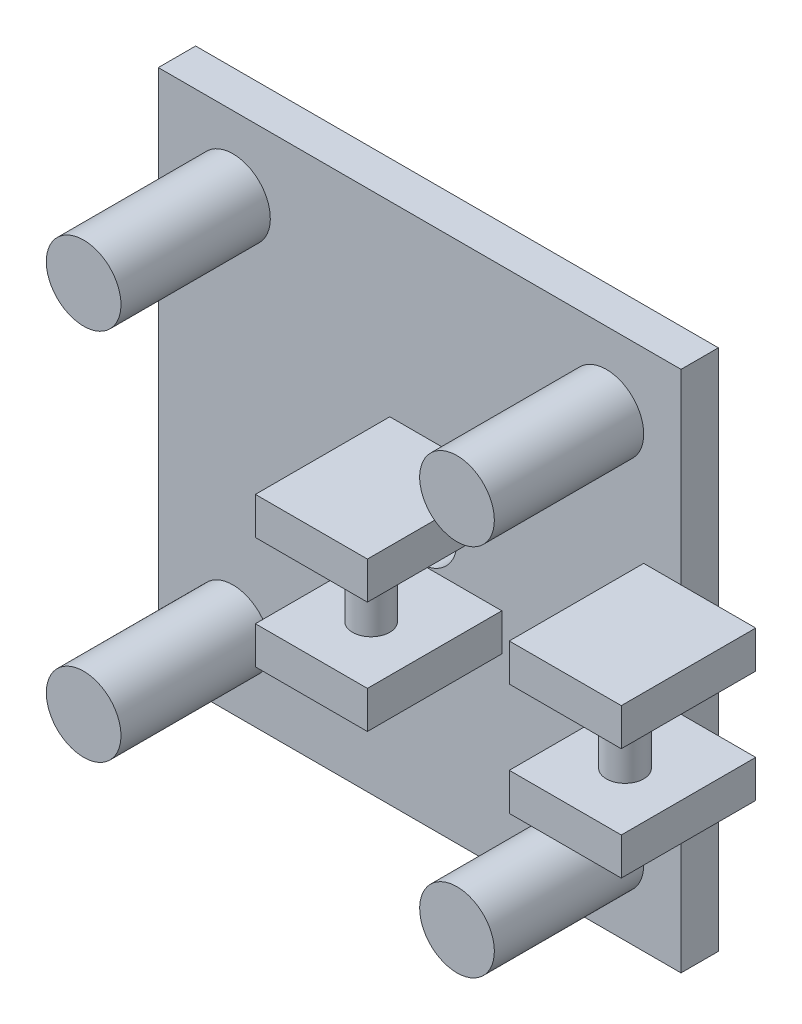
ISO-10303-21;
HEADER;
FILE_DESCRIPTION(('STEP AP214'),'2;1');
FILE_NAME('part.step','',(''),(''),'','','');
FILE_SCHEMA(('AUTOMOTIVE_DESIGN { 1 0 10303 214 1 1 1 1 }'));
ENDSEC;
DATA;
#1=APPLICATION_CONTEXT('core data for automotive mechanical design processes');
#2=APPLICATION_PROTOCOL_DEFINITION('international standard','automotive_design',2000,#1);
#3=PRODUCT_CONTEXT('',#1,'mechanical');
#4=PRODUCT('Part','Part','',(#3));
#5=PRODUCT_RELATED_PRODUCT_CATEGORY('part','',(#4));
#6=PRODUCT_DEFINITION_FORMATION('','',#4);
#7=PRODUCT_DEFINITION_CONTEXT('part definition',#1,'design');
#8=PRODUCT_DEFINITION('design','',#6,#7);
#9=PRODUCT_DEFINITION_SHAPE('','',#8);
#10=(LENGTH_UNIT() NAMED_UNIT(*) SI_UNIT(.MILLI.,.METRE.));
#11=(NAMED_UNIT(*) PLANE_ANGLE_UNIT() SI_UNIT($,.RADIAN.));
#12=(NAMED_UNIT(*) SI_UNIT($,.STERADIAN.) SOLID_ANGLE_UNIT());
#13=UNCERTAINTY_MEASURE_WITH_UNIT(LENGTH_MEASURE(1.E-05),#10,'distance_accuracy_value','');
#14=(GEOMETRIC_REPRESENTATION_CONTEXT(3) GLOBAL_UNCERTAINTY_ASSIGNED_CONTEXT((#13)) GLOBAL_UNIT_ASSIGNED_CONTEXT((#10,
#11,#12)) REPRESENTATION_CONTEXT('',''));
#15=CARTESIAN_POINT('',(0.,0.,0.));
#16=DIRECTION('',(0.,0.,1.));
#17=DIRECTION('',(1.,0.,0.));
#18=AXIS2_PLACEMENT_3D('',#15,#16,#17);
#19=CARTESIAN_POINT('',(0.,0.,5.));
#20=DIRECTION('',(0.,0.,1.));
#21=DIRECTION('',(1.,0.,0.));
#22=AXIS2_PLACEMENT_3D('',#19,#20,#21);
#23=PLANE('',#22);
#24=CARTESIAN_POINT('',(-24.9999999999997,25.0000000000003,5.));
#25=DIRECTION('',(0.,0.,1.));
#26=DIRECTION('',(0.,1.,0.));
#27=AXIS2_PLACEMENT_3D('',#24,#25,#26);
#28=CIRCLE('',#27,5.);
#29=CARTESIAN_POINT('',(-24.9999999999997,30.0000000000003,5.));
#30=VERTEX_POINT('',#29);
#31=EDGE_CURVE('E316',#30,#30,#28,.T.);
#32=ORIENTED_EDGE('',*,*,#31,.F.);
#33=EDGE_LOOP('',(#32));
#34=FACE_BOUND('',#33,.T.);
#35=CARTESIAN_POINT('',(-25.,-25.,5.));
#36=DIRECTION('',(0.,0.,1.));
#37=DIRECTION('',(-1.,0.,0.));
#38=AXIS2_PLACEMENT_3D('',#35,#36,#37);
#39=CIRCLE('',#38,5.);
#40=CARTESIAN_POINT('',(-30.,-25.,5.));
#41=VERTEX_POINT('',#40);
#42=EDGE_CURVE('E320',#41,#41,#39,.T.);
#43=ORIENTED_EDGE('',*,*,#42,.F.);
#44=EDGE_LOOP('',(#43));
#45=FACE_BOUND('',#44,.T.);
#46=CARTESIAN_POINT('',(24.9999999999999,-25.0000000000001,5.));
#47=DIRECTION('',(0.,0.,1.));
#48=DIRECTION('',(0.,-1.,0.));
#49=AXIS2_PLACEMENT_3D('',#46,#47,#48);
#50=CIRCLE('',#49,5.);
#51=CARTESIAN_POINT('',(24.9999999999999,-30.0000000000001,5.));
#52=VERTEX_POINT('',#51);
#53=EDGE_CURVE('E326',#52,#52,#50,.T.);
#54=ORIENTED_EDGE('',*,*,#53,.F.);
#55=EDGE_LOOP('',(#54));
#56=FACE_BOUND('',#55,.T.);
#57=CARTESIAN_POINT('',(25.,25.,5.));
#58=DIRECTION('',(0.,0.,1.));
#59=DIRECTION('',(1.,0.,0.));
#60=AXIS2_PLACEMENT_3D('',#57,#58,#59);
#61=CIRCLE('',#60,5.);
#62=CARTESIAN_POINT('',(30.,25.,5.));
#63=VERTEX_POINT('',#62);
#64=EDGE_CURVE('E332',#63,#63,#61,.T.);
#65=ORIENTED_EDGE('',*,*,#64,.F.);
#66=EDGE_LOOP('',(#65));
#67=FACE_BOUND('',#66,.T.);
#68=DIRECTION('',(-1.,0.,0.));
#69=VECTOR('',#68,1.);
#70=CARTESIAN_POINT('',(-4.,10.,5.));
#71=LINE('',#70,#69);
#72=CARTESIAN_POINT('',(11.,10.,5.));
#73=VERTEX_POINT('',#72);
#74=CARTESIAN_POINT('',(-4.,10.,5.));
#75=VERTEX_POINT('',#74);
#76=EDGE_CURVE('E269',#73,#75,#71,.T.);
#77=ORIENTED_EDGE('',*,*,#76,.F.);
#78=DIRECTION('',(0.,1.,0.));
#79=VECTOR('',#78,1.);
#80=CARTESIAN_POINT('',(11.,5.,5.));
#81=LINE('',#80,#79);
#82=CARTESIAN_POINT('',(11.,5.,5.));
#83=VERTEX_POINT('',#82);
#84=EDGE_CURVE('E255',#83,#73,#81,.T.);
#85=ORIENTED_EDGE('',*,*,#84,.F.);
#86=DIRECTION('',(1.,0.,0.));
#87=VECTOR('',#86,1.);
#88=CARTESIAN_POINT('',(-4.,5.,5.));
#89=LINE('',#88,#87);
#90=CARTESIAN_POINT('',(0.,5.,5.));
#91=VERTEX_POINT('',#90);
#92=EDGE_CURVE('E274',#91,#83,#89,.T.);
#93=ORIENTED_EDGE('',*,*,#92,.F.);
#94=CARTESIAN_POINT('',(0.,0.,5.));
#95=DIRECTION('',(0.,0.,1.));
#96=DIRECTION('',(1.,0.,0.));
#97=AXIS2_PLACEMENT_3D('',#94,#95,#96);
#98=CIRCLE('',#97,5.);
#99=CARTESIAN_POINT('',(0.,-5.,5.));
#100=VERTEX_POINT('',#99);
#101=EDGE_CURVE('E341',#100,#91,#98,.T.);
#102=ORIENTED_EDGE('',*,*,#101,.F.);
#103=DIRECTION('',(-1.,0.,0.));
#104=VECTOR('',#103,1.);
#105=CARTESIAN_POINT('',(-4.,-5.,5.));
#106=LINE('',#105,#104);
#107=CARTESIAN_POINT('',(11.,-5.,5.));
#108=VERTEX_POINT('',#107);
#109=EDGE_CURVE('E300',#108,#100,#106,.T.);
#110=ORIENTED_EDGE('',*,*,#109,.F.);
#111=DIRECTION('',(0.,1.,0.));
#112=VECTOR('',#111,1.);
#113=CARTESIAN_POINT('',(11.,-10.,5.));
#114=LINE('',#113,#112);
#115=CARTESIAN_POINT('',(11.,-10.,5.));
#116=VERTEX_POINT('',#115);
#117=EDGE_CURVE('E285',#116,#108,#114,.T.);
#118=ORIENTED_EDGE('',*,*,#117,.F.);
#119=DIRECTION('',(1.,0.,0.));
#120=VECTOR('',#119,1.);
#121=CARTESIAN_POINT('',(-4.,-10.,5.));
#122=LINE('',#121,#120);
#123=CARTESIAN_POINT('',(-4.,-10.,5.));
#124=VERTEX_POINT('',#123);
#125=EDGE_CURVE('E290',#124,#116,#122,.T.);
#126=ORIENTED_EDGE('',*,*,#125,.F.);
#127=DIRECTION('',(0.,-1.,0.));
#128=VECTOR('',#127,1.);
#129=CARTESIAN_POINT('',(-4.,-10.,5.));
#130=LINE('',#129,#128);
#131=CARTESIAN_POINT('',(-4.,-5.,5.));
#132=VERTEX_POINT('',#131);
#133=EDGE_CURVE('E303',#132,#124,#130,.T.);
#134=ORIENTED_EDGE('',*,*,#133,.F.);
#135=EDGE_CURVE('E299',#100,#132,#106,.T.);
#136=ORIENTED_EDGE('',*,*,#135,.F.);
#137=EDGE_CURVE('E345',#91,#100,#98,.T.);
#138=ORIENTED_EDGE('',*,*,#137,.F.);
#139=CARTESIAN_POINT('',(-4.,5.,5.));
#140=VERTEX_POINT('',#139);
#141=EDGE_CURVE('E260',#140,#91,#89,.T.);
#142=ORIENTED_EDGE('',*,*,#141,.F.);
#143=DIRECTION('',(0.,-1.,0.));
#144=VECTOR('',#143,1.);
#145=CARTESIAN_POINT('',(-4.,5.,5.));
#146=LINE('',#145,#144);
#147=EDGE_CURVE('E271',#75,#140,#146,.T.);
#148=ORIENTED_EDGE('',*,*,#147,.F.);
#149=EDGE_LOOP('',(#77,#85,#93,#102,#110,#118,#126,#134,#136,#138,#142,#148));
#150=FACE_BOUND('',#149,.T.);
#151=DIRECTION('',(0.,-1.,0.));
#152=VECTOR('',#151,1.);
#153=CARTESIAN_POINT('',(30.,5.,5.));
#154=LINE('',#153,#152);
#155=CARTESIAN_POINT('',(30.,10.,5.));
#156=VERTEX_POINT('',#155);
#157=CARTESIAN_POINT('',(30.,5.,5.));
#158=VERTEX_POINT('',#157);
#159=EDGE_CURVE('E50',#156,#158,#154,.T.);
#160=ORIENTED_EDGE('',*,*,#159,.F.);
#161=DIRECTION('',(-1.,0.,0.));
#162=VECTOR('',#161,1.);
#163=CARTESIAN_POINT('',(30.,10.,5.));
#164=LINE('',#163,#162);
#165=CARTESIAN_POINT('',(35.,10.,5.));
#166=VERTEX_POINT('',#165);
#167=EDGE_CURVE('E392',#166,#156,#164,.T.);
#168=ORIENTED_EDGE('',*,*,#167,.F.);
#169=DIRECTION('',(0.,1.,0.));
#170=VECTOR('',#169,1.);
#171=CARTESIAN_POINT('',(35.,35.,5.));
#172=LINE('',#171,#170);
#173=CARTESIAN_POINT('',(35.,35.,5.));
#174=VERTEX_POINT('',#173);
#175=EDGE_CURVE('E353',#166,#174,#172,.T.);
#176=ORIENTED_EDGE('',*,*,#175,.T.);
#177=DIRECTION('',(-1.,0.,0.));
#178=VECTOR('',#177,1.);
#179=CARTESIAN_POINT('',(-35.,35.,5.));
#180=LINE('',#179,#178);
#181=CARTESIAN_POINT('',(-35.,35.,5.));
#182=VERTEX_POINT('',#181);
#183=EDGE_CURVE('E351',#174,#182,#180,.T.);
#184=ORIENTED_EDGE('',*,*,#183,.T.);
#185=DIRECTION('',(0.,-1.,0.));
#186=VECTOR('',#185,1.);
#187=CARTESIAN_POINT('',(-35.,35.,5.));
#188=LINE('',#187,#186);
#189=CARTESIAN_POINT('',(-35.,-35.,5.));
#190=VERTEX_POINT('',#189);
#191=EDGE_CURVE('E355',#182,#190,#188,.T.);
#192=ORIENTED_EDGE('',*,*,#191,.T.);
#193=DIRECTION('',(1.,0.,0.));
#194=VECTOR('',#193,1.);
#195=CARTESIAN_POINT('',(-35.,-35.,5.));
#196=LINE('',#195,#194);
#197=CARTESIAN_POINT('',(35.,-35.,5.));
#198=VERTEX_POINT('',#197);
#199=EDGE_CURVE('E357',#190,#198,#196,.T.);
#200=ORIENTED_EDGE('',*,*,#199,.T.);
#201=CARTESIAN_POINT('',(35.,-10.,5.));
#202=VERTEX_POINT('',#201);
#203=EDGE_CURVE('E348',#198,#202,#172,.T.);
#204=ORIENTED_EDGE('',*,*,#203,.T.);
#205=DIRECTION('',(1.,0.,0.));
#206=VECTOR('',#205,1.);
#207=CARTESIAN_POINT('',(30.,-10.,5.));
#208=LINE('',#207,#206);
#209=CARTESIAN_POINT('',(30.,-10.,5.));
#210=VERTEX_POINT('',#209);
#211=EDGE_CURVE('E228',#210,#202,#208,.T.);
#212=ORIENTED_EDGE('',*,*,#211,.F.);
#213=DIRECTION('',(0.,-1.,0.));
#214=VECTOR('',#213,1.);
#215=CARTESIAN_POINT('',(30.,-10.,5.));
#216=LINE('',#215,#214);
#217=CARTESIAN_POINT('',(30.,-5.,5.));
#218=VERTEX_POINT('',#217);
#219=EDGE_CURVE('E238',#218,#210,#216,.T.);
#220=ORIENTED_EDGE('',*,*,#219,.F.);
#221=DIRECTION('',(-1.,0.,0.));
#222=VECTOR('',#221,1.);
#223=CARTESIAN_POINT('',(30.,-5.,5.));
#224=LINE('',#223,#222);
#225=CARTESIAN_POINT('',(35.,-5.,5.));
#226=VERTEX_POINT('',#225);
#227=EDGE_CURVE('E218',#226,#218,#224,.T.);
#228=ORIENTED_EDGE('',*,*,#227,.F.);
#229=CARTESIAN_POINT('',(35.,5.,5.));
#230=VERTEX_POINT('',#229);
#231=EDGE_CURVE('E857',#226,#230,#172,.T.);
#232=ORIENTED_EDGE('',*,*,#231,.T.);
#233=DIRECTION('',(1.,0.,0.));
#234=VECTOR('',#233,1.);
#235=CARTESIAN_POINT('',(30.,5.,5.));
#236=LINE('',#235,#234);
#237=EDGE_CURVE('E55',#158,#230,#236,.T.);
#238=ORIENTED_EDGE('',*,*,#237,.F.);
#239=EDGE_LOOP('',(#160,#168,#176,#184,#192,#200,#204,#212,#220,#228,#232,#238));
#240=FACE_BOUND('',#239,.T.);
#241=ADVANCED_FACE('F33',(#34,#45,#56,#67,#150,#240),#23,.T.);
#242=CARTESIAN_POINT('',(0.,0.,0.));
#243=DIRECTION('',(0.,0.,1.));
#244=DIRECTION('',(1.,0.,0.));
#245=AXIS2_PLACEMENT_3D('',#242,#243,#244);
#246=PLANE('',#245);
#247=DIRECTION('',(0.,1.,0.));
#248=VECTOR('',#247,1.);
#249=CARTESIAN_POINT('',(35.,35.,0.));
#250=LINE('',#249,#248);
#251=CARTESIAN_POINT('',(35.,-35.,0.));
#252=VERTEX_POINT('',#251);
#253=CARTESIAN_POINT('',(35.,35.,0.));
#254=VERTEX_POINT('',#253);
#255=EDGE_CURVE('E344',#252,#254,#250,.T.);
#256=ORIENTED_EDGE('',*,*,#255,.F.);
#257=DIRECTION('',(1.,0.,0.));
#258=VECTOR('',#257,1.);
#259=CARTESIAN_POINT('',(-35.,-35.,0.));
#260=LINE('',#259,#258);
#261=CARTESIAN_POINT('',(-35.,-35.,0.));
#262=VERTEX_POINT('',#261);
#263=EDGE_CURVE('E366',#262,#252,#260,.T.);
#264=ORIENTED_EDGE('',*,*,#263,.F.);
#265=DIRECTION('',(0.,-1.,0.));
#266=VECTOR('',#265,1.);
#267=CARTESIAN_POINT('',(-35.,35.,0.));
#268=LINE('',#267,#266);
#269=CARTESIAN_POINT('',(-35.,35.,0.));
#270=VERTEX_POINT('',#269);
#271=EDGE_CURVE('E364',#270,#262,#268,.T.);
#272=ORIENTED_EDGE('',*,*,#271,.F.);
#273=DIRECTION('',(-1.,0.,0.));
#274=VECTOR('',#273,1.);
#275=CARTESIAN_POINT('',(-35.,35.,0.));
#276=LINE('',#275,#274);
#277=EDGE_CURVE('E362',#254,#270,#276,.T.);
#278=ORIENTED_EDGE('',*,*,#277,.F.);
#279=EDGE_LOOP('',(#256,#264,#272,#278));
#280=FACE_BOUND('',#279,.T.);
#281=CARTESIAN_POINT('',(0.,0.,0.));
#282=DIRECTION('',(0.,0.,1.));
#283=DIRECTION('',(1.,0.,0.));
#284=AXIS2_PLACEMENT_3D('',#281,#282,#283);
#285=CIRCLE('',#284,5.);
#286=CARTESIAN_POINT('',(5.,0.,0.));
#287=VERTEX_POINT('',#286);
#288=EDGE_CURVE('E338',#287,#287,#285,.T.);
#289=ORIENTED_EDGE('',*,*,#288,.T.);
#290=EDGE_LOOP('',(#289));
#291=FACE_BOUND('',#290,.T.);
#292=ADVANCED_FACE('F414',(#280,#291),#246,.F.);
#293=CARTESIAN_POINT('',(35.,35.,5.));
#294=DIRECTION('',(-1.,0.,0.));
#295=DIRECTION('',(0.,-1.,0.));
#296=AXIS2_PLACEMENT_3D('',#293,#294,#295);
#297=PLANE('',#296);
#298=ORIENTED_EDGE('',*,*,#255,.T.);
#299=DIRECTION('',(0.,0.,-1.));
#300=VECTOR('',#299,1.);
#301=CARTESIAN_POINT('',(35.,35.,5.));
#302=LINE('',#301,#300);
#303=EDGE_CURVE('E11',#174,#254,#302,.T.);
#304=ORIENTED_EDGE('',*,*,#303,.F.);
#305=ORIENTED_EDGE('',*,*,#175,.F.);
#306=EDGE_CURVE('E856',#230,#166,#172,.T.);
#307=ORIENTED_EDGE('',*,*,#306,.F.);
#308=ORIENTED_EDGE('',*,*,#231,.F.);
#309=EDGE_CURVE('E352',#202,#226,#172,.T.);
#310=ORIENTED_EDGE('',*,*,#309,.F.);
#311=ORIENTED_EDGE('',*,*,#203,.F.);
#312=DIRECTION('',(0.,0.,-1.));
#313=VECTOR('',#312,1.);
#314=CARTESIAN_POINT('',(35.,-35.,5.));
#315=LINE('',#314,#313);
#316=EDGE_CURVE('E359',#198,#252,#315,.T.);
#317=ORIENTED_EDGE('',*,*,#316,.T.);
#318=EDGE_LOOP('',(#298,#304,#305,#307,#308,#310,#311,#317));
#319=FACE_BOUND('',#318,.T.);
#320=ADVANCED_FACE('F35',(#319),#297,.F.);
#321=CARTESIAN_POINT('',(-35.,35.,5.));
#322=DIRECTION('',(0.,-1.,0.));
#323=DIRECTION('',(0.,0.,-1.));
#324=AXIS2_PLACEMENT_3D('',#321,#322,#323);
#325=PLANE('',#324);
#326=ORIENTED_EDGE('',*,*,#277,.T.);
#327=DIRECTION('',(0.,0.,-1.));
#328=VECTOR('',#327,1.);
#329=CARTESIAN_POINT('',(-35.,35.,5.));
#330=LINE('',#329,#328);
#331=EDGE_CURVE('E42',#182,#270,#330,.T.);
#332=ORIENTED_EDGE('',*,*,#331,.F.);
#333=ORIENTED_EDGE('',*,*,#183,.F.);
#334=ORIENTED_EDGE('',*,*,#303,.T.);
#335=EDGE_LOOP('',(#326,#332,#333,#334));
#336=FACE_BOUND('',#335,.T.);
#337=ADVANCED_FACE('F436',(#336),#325,.F.);
#338=CARTESIAN_POINT('',(-35.,35.,5.));
#339=DIRECTION('',(1.,0.,0.));
#340=DIRECTION('',(0.,1.,0.));
#341=AXIS2_PLACEMENT_3D('',#338,#339,#340);
#342=PLANE('',#341);
#343=ORIENTED_EDGE('',*,*,#271,.T.);
#344=DIRECTION('',(0.,0.,-1.));
#345=VECTOR('',#344,1.);
#346=CARTESIAN_POINT('',(-35.,-35.,5.));
#347=LINE('',#346,#345);
#348=EDGE_CURVE('E370',#190,#262,#347,.T.);
#349=ORIENTED_EDGE('',*,*,#348,.F.);
#350=ORIENTED_EDGE('',*,*,#191,.F.);
#351=ORIENTED_EDGE('',*,*,#331,.T.);
#352=EDGE_LOOP('',(#343,#349,#350,#351));
#353=FACE_BOUND('',#352,.T.);
#354=ADVANCED_FACE('F433',(#353),#342,.F.);
#355=CARTESIAN_POINT('',(-35.,-35.,5.));
#356=DIRECTION('',(0.,1.,0.));
#357=DIRECTION('',(0.,0.,1.));
#358=AXIS2_PLACEMENT_3D('',#355,#356,#357);
#359=PLANE('',#358);
#360=ORIENTED_EDGE('',*,*,#263,.T.);
#361=ORIENTED_EDGE('',*,*,#316,.F.);
#362=ORIENTED_EDGE('',*,*,#199,.F.);
#363=ORIENTED_EDGE('',*,*,#348,.T.);
#364=EDGE_LOOP('',(#360,#361,#362,#363));
#365=FACE_BOUND('',#364,.T.);
#366=ADVANCED_FACE('F430',(#365),#359,.F.);
#367=CARTESIAN_POINT('',(0.,0.,5.));
#368=DIRECTION('',(0.,0.,-1.));
#369=DIRECTION('',(-1.,0.,0.));
#370=AXIS2_PLACEMENT_3D('',#367,#368,#369);
#371=CYLINDRICAL_SURFACE('',#370,5.);
#372=ORIENTED_EDGE('',*,*,#101,.T.);
#373=ORIENTED_EDGE('',*,*,#137,.T.);
#374=EDGE_LOOP('',(#372,#373));
#375=FACE_BOUND('',#374,.T.);
#376=ORIENTED_EDGE('',*,*,#288,.F.);
#377=EDGE_LOOP('',(#376));
#378=FACE_BOUND('',#377,.T.);
#379=ADVANCED_FACE('F427',(#375,#378),#371,.F.);
#380=CARTESIAN_POINT('',(25.,25.,25.));
#381=DIRECTION('',(0.,0.,-1.));
#382=DIRECTION('',(-1.,0.,0.));
#383=AXIS2_PLACEMENT_3D('',#380,#381,#382);
#384=CYLINDRICAL_SURFACE('',#383,5.);
#385=CARTESIAN_POINT('',(25.,25.,25.));
#386=DIRECTION('',(0.,0.,1.));
#387=DIRECTION('',(1.,0.,0.));
#388=AXIS2_PLACEMENT_3D('',#385,#386,#387);
#389=CIRCLE('',#388,5.);
#390=CARTESIAN_POINT('',(30.,25.,25.));
#391=VERTEX_POINT('',#390);
#392=EDGE_CURVE('E335',#391,#391,#389,.T.);
#393=ORIENTED_EDGE('',*,*,#392,.F.);
#394=EDGE_LOOP('',(#393));
#395=FACE_BOUND('',#394,.T.);
#396=ORIENTED_EDGE('',*,*,#64,.T.);
#397=EDGE_LOOP('',(#396));
#398=FACE_BOUND('',#397,.T.);
#399=ADVANCED_FACE('F565',(#395,#398),#384,.T.);
#400=CARTESIAN_POINT('',(25.,25.,25.));
#401=DIRECTION('',(0.,0.,1.));
#402=DIRECTION('',(1.,0.,0.));
#403=AXIS2_PLACEMENT_3D('',#400,#401,#402);
#404=PLANE('',#403);
#405=ORIENTED_EDGE('',*,*,#392,.T.);
#406=EDGE_LOOP('',(#405));
#407=FACE_BOUND('',#406,.T.);
#408=ADVANCED_FACE('F562',(#407),#404,.T.);
#409=CARTESIAN_POINT('',(24.9999999999999,-25.0000000000001,25.));
#410=DIRECTION('',(0.,0.,-1.));
#411=DIRECTION('',(-1.,0.,0.));
#412=AXIS2_PLACEMENT_3D('',#409,#410,#411);
#413=CYLINDRICAL_SURFACE('',#412,5.);
#414=CARTESIAN_POINT('',(24.9999999999999,-25.0000000000001,25.));
#415=DIRECTION('',(0.,0.,1.));
#416=DIRECTION('',(0.,-1.,0.));
#417=AXIS2_PLACEMENT_3D('',#414,#415,#416);
#418=CIRCLE('',#417,5.);
#419=CARTESIAN_POINT('',(24.9999999999999,-30.0000000000001,25.));
#420=VERTEX_POINT('',#419);
#421=EDGE_CURVE('E329',#420,#420,#418,.T.);
#422=ORIENTED_EDGE('',*,*,#421,.F.);
#423=EDGE_LOOP('',(#422));
#424=FACE_BOUND('',#423,.T.);
#425=ORIENTED_EDGE('',*,*,#53,.T.);
#426=EDGE_LOOP('',(#425));
#427=FACE_BOUND('',#426,.T.);
#428=ADVANCED_FACE('F558',(#424,#427),#413,.T.);
#429=CARTESIAN_POINT('',(24.9999999999999,-25.0000000000001,25.));
#430=DIRECTION('',(0.,0.,1.));
#431=DIRECTION('',(0.,-1.,0.));
#432=AXIS2_PLACEMENT_3D('',#429,#430,#431);
#433=PLANE('',#432);
#434=ORIENTED_EDGE('',*,*,#421,.T.);
#435=EDGE_LOOP('',(#434));
#436=FACE_BOUND('',#435,.T.);
#437=ADVANCED_FACE('F554',(#436),#433,.T.);
#438=CARTESIAN_POINT('',(-25.,-25.,25.));
#439=DIRECTION('',(0.,0.,-1.));
#440=DIRECTION('',(-1.,0.,0.));
#441=AXIS2_PLACEMENT_3D('',#438,#439,#440);
#442=CYLINDRICAL_SURFACE('',#441,5.);
#443=CARTESIAN_POINT('',(-25.,-25.,25.));
#444=DIRECTION('',(0.,0.,1.));
#445=DIRECTION('',(-1.,0.,0.));
#446=AXIS2_PLACEMENT_3D('',#443,#444,#445);
#447=CIRCLE('',#446,5.);
#448=CARTESIAN_POINT('',(-30.,-25.,25.));
#449=VERTEX_POINT('',#448);
#450=EDGE_CURVE('E323',#449,#449,#447,.T.);
#451=ORIENTED_EDGE('',*,*,#450,.F.);
#452=EDGE_LOOP('',(#451));
#453=FACE_BOUND('',#452,.T.);
#454=ORIENTED_EDGE('',*,*,#42,.T.);
#455=EDGE_LOOP('',(#454));
#456=FACE_BOUND('',#455,.T.);
#457=ADVANCED_FACE('F550',(#453,#456),#442,.T.);
#458=CARTESIAN_POINT('',(-25.,-25.,25.));
#459=DIRECTION('',(0.,0.,1.));
#460=DIRECTION('',(-1.,0.,0.));
#461=AXIS2_PLACEMENT_3D('',#458,#459,#460);
#462=PLANE('',#461);
#463=ORIENTED_EDGE('',*,*,#450,.T.);
#464=EDGE_LOOP('',(#463));
#465=FACE_BOUND('',#464,.T.);
#466=ADVANCED_FACE('F546',(#465),#462,.T.);
#467=CARTESIAN_POINT('',(-24.9999999999997,25.0000000000003,25.));
#468=DIRECTION('',(0.,0.,-1.));
#469=DIRECTION('',(-1.,0.,0.));
#470=AXIS2_PLACEMENT_3D('',#467,#468,#469);
#471=CYLINDRICAL_SURFACE('',#470,5.);
#472=CARTESIAN_POINT('',(-24.9999999999997,25.0000000000003,25.));
#473=DIRECTION('',(0.,0.,1.));
#474=DIRECTION('',(0.,1.,0.));
#475=AXIS2_PLACEMENT_3D('',#472,#473,#474);
#476=CIRCLE('',#475,5.);
#477=CARTESIAN_POINT('',(-24.9999999999997,30.0000000000003,25.));
#478=VERTEX_POINT('',#477);
#479=EDGE_CURVE('E317',#478,#478,#476,.T.);
#480=ORIENTED_EDGE('',*,*,#479,.F.);
#481=EDGE_LOOP('',(#480));
#482=FACE_BOUND('',#481,.T.);
#483=ORIENTED_EDGE('',*,*,#31,.T.);
#484=EDGE_LOOP('',(#483));
#485=FACE_BOUND('',#484,.T.);
#486=ADVANCED_FACE('F542',(#482,#485),#471,.T.);
#487=CARTESIAN_POINT('',(-24.9999999999997,25.0000000000003,25.));
#488=DIRECTION('',(0.,0.,1.));
#489=DIRECTION('',(0.,1.,0.));
#490=AXIS2_PLACEMENT_3D('',#487,#488,#489);
#491=PLANE('',#490);
#492=ORIENTED_EDGE('',*,*,#479,.T.);
#493=EDGE_LOOP('',(#492));
#494=FACE_BOUND('',#493,.T.);
#495=ADVANCED_FACE('F538',(#494),#491,.T.);
#496=CARTESIAN_POINT('',(11.,-10.,23.));
#497=DIRECTION('',(-1.,0.,0.));
#498=DIRECTION('',(0.,0.,1.));
#499=AXIS2_PLACEMENT_3D('',#496,#497,#498);
#500=PLANE('',#499);
#501=ORIENTED_EDGE('',*,*,#117,.T.);
#502=DIRECTION('',(0.,0.,-1.));
#503=VECTOR('',#502,1.);
#504=CARTESIAN_POINT('',(11.,-5.,23.));
#505=LINE('',#504,#503);
#506=CARTESIAN_POINT('',(11.,-5.,23.));
#507=VERTEX_POINT('',#506);
#508=EDGE_CURVE('E314',#507,#108,#505,.T.);
#509=ORIENTED_EDGE('',*,*,#508,.F.);
#510=DIRECTION('',(0.,1.,0.));
#511=VECTOR('',#510,1.);
#512=CARTESIAN_POINT('',(11.,-10.,23.));
#513=LINE('',#512,#511);
#514=CARTESIAN_POINT('',(11.,-10.,23.));
#515=VERTEX_POINT('',#514);
#516=EDGE_CURVE('E286',#515,#507,#513,.T.);
#517=ORIENTED_EDGE('',*,*,#516,.F.);
#518=DIRECTION('',(0.,0.,-1.));
#519=VECTOR('',#518,1.);
#520=CARTESIAN_POINT('',(11.,-10.,23.));
#521=LINE('',#520,#519);
#522=EDGE_CURVE('E296',#515,#116,#521,.T.);
#523=ORIENTED_EDGE('',*,*,#522,.T.);
#524=EDGE_LOOP('',(#501,#509,#517,#523));
#525=FACE_BOUND('',#524,.T.);
#526=ADVANCED_FACE('F534',(#525),#500,.F.);
#527=CARTESIAN_POINT('',(-4.,-5.,23.));
#528=DIRECTION('',(0.,-1.,0.));
#529=DIRECTION('',(0.,0.,-1.));
#530=AXIS2_PLACEMENT_3D('',#527,#528,#529);
#531=PLANE('',#530);
#532=CARTESIAN_POINT('',(3.5,-5.,15.));
#533=DIRECTION('',(0.,-1.,0.));
#534=DIRECTION('',(0.,0.,-1.));
#535=AXIS2_PLACEMENT_3D('',#532,#533,#534);
#536=CIRCLE('',#535,2.5);
#537=CARTESIAN_POINT('',(3.5,-5.,12.5));
#538=VERTEX_POINT('',#537);
#539=EDGE_CURVE('E376',#538,#538,#536,.T.);
#540=ORIENTED_EDGE('',*,*,#539,.T.);
#541=EDGE_LOOP('',(#540));
#542=FACE_BOUND('',#541,.T.);
#543=ORIENTED_EDGE('',*,*,#109,.T.);
#544=ORIENTED_EDGE('',*,*,#135,.T.);
#545=DIRECTION('',(0.,0.,-1.));
#546=VECTOR('',#545,1.);
#547=CARTESIAN_POINT('',(-4.,-5.,23.));
#548=LINE('',#547,#546);
#549=CARTESIAN_POINT('',(-4.,-5.,23.));
#550=VERTEX_POINT('',#549);
#551=EDGE_CURVE('E311',#550,#132,#548,.T.);
#552=ORIENTED_EDGE('',*,*,#551,.F.);
#553=DIRECTION('',(-1.,0.,0.));
#554=VECTOR('',#553,1.);
#555=CARTESIAN_POINT('',(-4.,-5.,23.));
#556=LINE('',#555,#554);
#557=EDGE_CURVE('E289',#507,#550,#556,.T.);
#558=ORIENTED_EDGE('',*,*,#557,.F.);
#559=ORIENTED_EDGE('',*,*,#508,.T.);
#560=EDGE_LOOP('',(#543,#544,#552,#558,#559));
#561=FACE_BOUND('',#560,.T.);
#562=ADVANCED_FACE('F530',(#542,#561),#531,.F.);
#563=CARTESIAN_POINT('',(-4.,-10.,23.));
#564=DIRECTION('',(1.,0.,0.));
#565=DIRECTION('',(0.,0.,-1.));
#566=AXIS2_PLACEMENT_3D('',#563,#564,#565);
#567=PLANE('',#566);
#568=ORIENTED_EDGE('',*,*,#133,.T.);
#569=DIRECTION('',(0.,0.,-1.));
#570=VECTOR('',#569,1.);
#571=CARTESIAN_POINT('',(-4.,-10.,23.));
#572=LINE('',#571,#570);
#573=CARTESIAN_POINT('',(-4.,-10.,23.));
#574=VERTEX_POINT('',#573);
#575=EDGE_CURVE('E309',#574,#124,#572,.T.);
#576=ORIENTED_EDGE('',*,*,#575,.F.);
#577=DIRECTION('',(0.,-1.,0.));
#578=VECTOR('',#577,1.);
#579=CARTESIAN_POINT('',(-4.,-10.,23.));
#580=LINE('',#579,#578);
#581=EDGE_CURVE('E292',#550,#574,#580,.T.);
#582=ORIENTED_EDGE('',*,*,#581,.F.);
#583=ORIENTED_EDGE('',*,*,#551,.T.);
#584=EDGE_LOOP('',(#568,#576,#582,#583));
#585=FACE_BOUND('',#584,.T.);
#586=ADVANCED_FACE('F526',(#585),#567,.F.);
#587=CARTESIAN_POINT('',(-4.,-10.,23.));
#588=DIRECTION('',(0.,1.,0.));
#589=DIRECTION('',(0.,0.,1.));
#590=AXIS2_PLACEMENT_3D('',#587,#588,#589);
#591=PLANE('',#590);
#592=ORIENTED_EDGE('',*,*,#125,.T.);
#593=ORIENTED_EDGE('',*,*,#522,.F.);
#594=DIRECTION('',(1.,0.,0.));
#595=VECTOR('',#594,1.);
#596=CARTESIAN_POINT('',(-4.,-10.,23.));
#597=LINE('',#596,#595);
#598=EDGE_CURVE('E294',#574,#515,#597,.T.);
#599=ORIENTED_EDGE('',*,*,#598,.F.);
#600=ORIENTED_EDGE('',*,*,#575,.T.);
#601=EDGE_LOOP('',(#592,#593,#599,#600));
#602=FACE_BOUND('',#601,.T.);
#603=ADVANCED_FACE('F522',(#602),#591,.F.);
#604=CARTESIAN_POINT('',(0.,0.,23.));
#605=DIRECTION('',(0.,0.,-1.));
#606=DIRECTION('',(-1.,0.,0.));
#607=AXIS2_PLACEMENT_3D('',#604,#605,#606);
#608=PLANE('',#607);
#609=ORIENTED_EDGE('',*,*,#516,.T.);
#610=ORIENTED_EDGE('',*,*,#557,.T.);
#611=ORIENTED_EDGE('',*,*,#581,.T.);
#612=ORIENTED_EDGE('',*,*,#598,.T.);
#613=EDGE_LOOP('',(#609,#610,#611,#612));
#614=FACE_BOUND('',#613,.T.);
#615=ADVANCED_FACE('F518',(#614),#608,.F.);
#616=CARTESIAN_POINT('',(11.,5.,23.));
#617=DIRECTION('',(-1.,0.,0.));
#618=DIRECTION('',(0.,0.,1.));
#619=AXIS2_PLACEMENT_3D('',#616,#617,#618);
#620=PLANE('',#619);
#621=ORIENTED_EDGE('',*,*,#84,.T.);
#622=DIRECTION('',(0.,0.,-1.));
#623=VECTOR('',#622,1.);
#624=CARTESIAN_POINT('',(11.,10.,23.));
#625=LINE('',#624,#623);
#626=CARTESIAN_POINT('',(11.,10.,23.));
#627=VERTEX_POINT('',#626);
#628=EDGE_CURVE('E283',#627,#73,#625,.T.);
#629=ORIENTED_EDGE('',*,*,#628,.F.);
#630=DIRECTION('',(0.,1.,0.));
#631=VECTOR('',#630,1.);
#632=CARTESIAN_POINT('',(11.,5.,23.));
#633=LINE('',#632,#631);
#634=CARTESIAN_POINT('',(11.,5.,23.));
#635=VERTEX_POINT('',#634);
#636=EDGE_CURVE('E256',#635,#627,#633,.T.);
#637=ORIENTED_EDGE('',*,*,#636,.F.);
#638=DIRECTION('',(0.,0.,-1.));
#639=VECTOR('',#638,1.);
#640=CARTESIAN_POINT('',(11.,5.,23.));
#641=LINE('',#640,#639);
#642=EDGE_CURVE('E266',#635,#83,#641,.T.);
#643=ORIENTED_EDGE('',*,*,#642,.T.);
#644=EDGE_LOOP('',(#621,#629,#637,#643));
#645=FACE_BOUND('',#644,.T.);
#646=ADVANCED_FACE('F514',(#645),#620,.F.);
#647=CARTESIAN_POINT('',(-4.,10.,23.));
#648=DIRECTION('',(0.,-1.,0.));
#649=DIRECTION('',(0.,0.,-1.));
#650=AXIS2_PLACEMENT_3D('',#647,#648,#649);
#651=PLANE('',#650);
#652=ORIENTED_EDGE('',*,*,#76,.T.);
#653=DIRECTION('',(0.,0.,-1.));
#654=VECTOR('',#653,1.);
#655=CARTESIAN_POINT('',(-4.,10.,23.));
#656=LINE('',#655,#654);
#657=CARTESIAN_POINT('',(-4.,10.,23.));
#658=VERTEX_POINT('',#657);
#659=EDGE_CURVE('E280',#658,#75,#656,.T.);
#660=ORIENTED_EDGE('',*,*,#659,.F.);
#661=DIRECTION('',(-1.,0.,0.));
#662=VECTOR('',#661,1.);
#663=CARTESIAN_POINT('',(-4.,10.,23.));
#664=LINE('',#663,#662);
#665=EDGE_CURVE('E259',#627,#658,#664,.T.);
#666=ORIENTED_EDGE('',*,*,#665,.F.);
#667=ORIENTED_EDGE('',*,*,#628,.T.);
#668=EDGE_LOOP('',(#652,#660,#666,#667));
#669=FACE_BOUND('',#668,.T.);
#670=ADVANCED_FACE('F510',(#669),#651,.F.);
#671=CARTESIAN_POINT('',(-4.,5.,23.));
#672=DIRECTION('',(1.,0.,0.));
#673=DIRECTION('',(0.,0.,-1.));
#674=AXIS2_PLACEMENT_3D('',#671,#672,#673);
#675=PLANE('',#674);
#676=ORIENTED_EDGE('',*,*,#147,.T.);
#677=DIRECTION('',(0.,0.,-1.));
#678=VECTOR('',#677,1.);
#679=CARTESIAN_POINT('',(-4.,5.,23.));
#680=LINE('',#679,#678);
#681=CARTESIAN_POINT('',(-4.,5.,23.));
#682=VERTEX_POINT('',#681);
#683=EDGE_CURVE('E278',#682,#140,#680,.T.);
#684=ORIENTED_EDGE('',*,*,#683,.F.);
#685=DIRECTION('',(0.,-1.,0.));
#686=VECTOR('',#685,1.);
#687=CARTESIAN_POINT('',(-4.,5.,23.));
#688=LINE('',#687,#686);
#689=EDGE_CURVE('E262',#658,#682,#688,.T.);
#690=ORIENTED_EDGE('',*,*,#689,.F.);
#691=ORIENTED_EDGE('',*,*,#659,.T.);
#692=EDGE_LOOP('',(#676,#684,#690,#691));
#693=FACE_BOUND('',#692,.T.);
#694=ADVANCED_FACE('F507',(#693),#675,.F.);
#695=CARTESIAN_POINT('',(-4.,5.,23.));
#696=DIRECTION('',(0.,1.,0.));
#697=DIRECTION('',(0.,0.,1.));
#698=AXIS2_PLACEMENT_3D('',#695,#696,#697);
#699=PLANE('',#698);
#700=CARTESIAN_POINT('',(3.5,5.,15.));
#701=DIRECTION('',(0.,1.,0.));
#702=DIRECTION('',(0.,0.,1.));
#703=AXIS2_PLACEMENT_3D('',#700,#701,#702);
#704=CIRCLE('',#703,2.5);
#705=CARTESIAN_POINT('',(3.5,5.,17.5));
#706=VERTEX_POINT('',#705);
#707=EDGE_CURVE('E374',#706,#706,#704,.T.);
#708=ORIENTED_EDGE('',*,*,#707,.T.);
#709=EDGE_LOOP('',(#708));
#710=FACE_BOUND('',#709,.T.);
#711=ORIENTED_EDGE('',*,*,#141,.T.);
#712=ORIENTED_EDGE('',*,*,#92,.T.);
#713=ORIENTED_EDGE('',*,*,#642,.F.);
#714=DIRECTION('',(1.,0.,0.));
#715=VECTOR('',#714,1.);
#716=CARTESIAN_POINT('',(-4.,5.,23.));
#717=LINE('',#716,#715);
#718=EDGE_CURVE('E264',#682,#635,#717,.T.);
#719=ORIENTED_EDGE('',*,*,#718,.F.);
#720=ORIENTED_EDGE('',*,*,#683,.T.);
#721=EDGE_LOOP('',(#711,#712,#713,#719,#720));
#722=FACE_BOUND('',#721,.T.);
#723=ADVANCED_FACE('F503',(#710,#722),#699,.F.);
#724=CARTESIAN_POINT('',(0.,0.,23.));
#725=DIRECTION('',(0.,0.,-1.));
#726=DIRECTION('',(-1.,0.,0.));
#727=AXIS2_PLACEMENT_3D('',#724,#725,#726);
#728=PLANE('',#727);
#729=ORIENTED_EDGE('',*,*,#636,.T.);
#730=ORIENTED_EDGE('',*,*,#665,.T.);
#731=ORIENTED_EDGE('',*,*,#689,.T.);
#732=ORIENTED_EDGE('',*,*,#718,.T.);
#733=EDGE_LOOP('',(#729,#730,#731,#732));
#734=FACE_BOUND('',#733,.T.);
#735=ADVANCED_FACE('F493',(#734),#728,.F.);
#736=CARTESIAN_POINT('',(0.,0.,5.));
#737=DIRECTION('',(0.,0.,-1.));
#738=DIRECTION('',(-1.,0.,0.));
#739=AXIS2_PLACEMENT_3D('',#736,#737,#738);
#740=PLANE('',#739);
#741=ORIENTED_EDGE('',*,*,#309,.T.);
#742=CARTESIAN_POINT('',(45.,-5.,5.));
#743=VERTEX_POINT('',#742);
#744=EDGE_CURVE('E235',#743,#226,#224,.T.);
#745=ORIENTED_EDGE('',*,*,#744,.F.);
#746=DIRECTION('',(0.,1.,0.));
#747=VECTOR('',#746,1.);
#748=CARTESIAN_POINT('',(45.,-10.,5.));
#749=LINE('',#748,#747);
#750=CARTESIAN_POINT('',(45.,-10.,5.));
#751=VERTEX_POINT('',#750);
#752=EDGE_CURVE('E215',#751,#743,#749,.T.);
#753=ORIENTED_EDGE('',*,*,#752,.F.);
#754=EDGE_CURVE('E241',#202,#751,#208,.T.);
#755=ORIENTED_EDGE('',*,*,#754,.F.);
#756=EDGE_LOOP('',(#741,#745,#753,#755));
#757=FACE_BOUND('',#756,.T.);
#758=ADVANCED_FACE('F460',(#757),#740,.T.);
#759=CARTESIAN_POINT('',(45.,-10.,23.));
#760=DIRECTION('',(-1.,0.,0.));
#761=DIRECTION('',(0.,0.,1.));
#762=AXIS2_PLACEMENT_3D('',#759,#760,#761);
#763=PLANE('',#762);
#764=ORIENTED_EDGE('',*,*,#752,.T.);
#765=DIRECTION('',(0.,0.,-1.));
#766=VECTOR('',#765,1.);
#767=CARTESIAN_POINT('',(45.,-5.,23.));
#768=LINE('',#767,#766);
#769=CARTESIAN_POINT('',(45.,-5.,23.));
#770=VERTEX_POINT('',#769);
#771=EDGE_CURVE('E252',#770,#743,#768,.T.);
#772=ORIENTED_EDGE('',*,*,#771,.F.);
#773=DIRECTION('',(0.,1.,0.));
#774=VECTOR('',#773,1.);
#775=CARTESIAN_POINT('',(45.,-10.,23.));
#776=LINE('',#775,#774);
#777=CARTESIAN_POINT('',(45.,-10.,23.));
#778=VERTEX_POINT('',#777);
#779=EDGE_CURVE('E224',#778,#770,#776,.T.);
#780=ORIENTED_EDGE('',*,*,#779,.F.);
#781=DIRECTION('',(0.,0.,-1.));
#782=VECTOR('',#781,1.);
#783=CARTESIAN_POINT('',(45.,-10.,23.));
#784=LINE('',#783,#782);
#785=EDGE_CURVE('E233',#778,#751,#784,.T.);
#786=ORIENTED_EDGE('',*,*,#785,.T.);
#787=EDGE_LOOP('',(#764,#772,#780,#786));
#788=FACE_BOUND('',#787,.T.);
#789=ADVANCED_FACE('F477',(#788),#763,.F.);
#790=CARTESIAN_POINT('',(30.,-5.,23.));
#791=DIRECTION('',(0.,-1.,0.));
#792=DIRECTION('',(1.,0.,0.));
#793=AXIS2_PLACEMENT_3D('',#790,#791,#792);
#794=PLANE('',#793);
#795=CARTESIAN_POINT('',(37.5,-5.,15.));
#796=DIRECTION('',(0.,-1.,0.));
#797=DIRECTION('',(1.,0.,0.));
#798=AXIS2_PLACEMENT_3D('',#795,#796,#797);
#799=CIRCLE('',#798,2.5);
#800=CARTESIAN_POINT('',(40.,-5.,15.));
#801=VERTEX_POINT('',#800);
#802=EDGE_CURVE('E377',#801,#801,#799,.T.);
#803=ORIENTED_EDGE('',*,*,#802,.T.);
#804=EDGE_LOOP('',(#803));
#805=FACE_BOUND('',#804,.T.);
#806=ORIENTED_EDGE('',*,*,#744,.T.);
#807=ORIENTED_EDGE('',*,*,#227,.T.);
#808=DIRECTION('',(0.,0.,-1.));
#809=VECTOR('',#808,1.);
#810=CARTESIAN_POINT('',(30.,-5.,23.));
#811=LINE('',#810,#809);
#812=CARTESIAN_POINT('',(30.,-5.,23.));
#813=VERTEX_POINT('',#812);
#814=EDGE_CURVE('E249',#813,#218,#811,.T.);
#815=ORIENTED_EDGE('',*,*,#814,.F.);
#816=DIRECTION('',(-1.,0.,0.));
#817=VECTOR('',#816,1.);
#818=CARTESIAN_POINT('',(30.,-5.,23.));
#819=LINE('',#818,#817);
#820=EDGE_CURVE('E227',#770,#813,#819,.T.);
#821=ORIENTED_EDGE('',*,*,#820,.F.);
#822=ORIENTED_EDGE('',*,*,#771,.T.);
#823=EDGE_LOOP('',(#806,#807,#815,#821,#822));
#824=FACE_BOUND('',#823,.T.);
#825=ADVANCED_FACE('F473',(#805,#824),#794,.F.);
#826=CARTESIAN_POINT('',(30.,-10.,23.));
#827=DIRECTION('',(1.,0.,0.));
#828=DIRECTION('',(0.,0.,-1.));
#829=AXIS2_PLACEMENT_3D('',#826,#827,#828);
#830=PLANE('',#829);
#831=ORIENTED_EDGE('',*,*,#219,.T.);
#832=DIRECTION('',(0.,0.,-1.));
#833=VECTOR('',#832,1.);
#834=CARTESIAN_POINT('',(30.,-10.,23.));
#835=LINE('',#834,#833);
#836=CARTESIAN_POINT('',(30.,-10.,23.));
#837=VERTEX_POINT('',#836);
#838=EDGE_CURVE('E246',#837,#210,#835,.T.);
#839=ORIENTED_EDGE('',*,*,#838,.F.);
#840=DIRECTION('',(0.,-1.,0.));
#841=VECTOR('',#840,1.);
#842=CARTESIAN_POINT('',(30.,-10.,23.));
#843=LINE('',#842,#841);
#844=EDGE_CURVE('E230',#813,#837,#843,.T.);
#845=ORIENTED_EDGE('',*,*,#844,.F.);
#846=ORIENTED_EDGE('',*,*,#814,.T.);
#847=EDGE_LOOP('',(#831,#839,#845,#846));
#848=FACE_BOUND('',#847,.T.);
#849=ADVANCED_FACE('F468',(#848),#830,.F.);
#850=CARTESIAN_POINT('',(30.,-10.,23.));
#851=DIRECTION('',(0.,1.,0.));
#852=DIRECTION('',(0.,0.,1.));
#853=AXIS2_PLACEMENT_3D('',#850,#851,#852);
#854=PLANE('',#853);
#855=ORIENTED_EDGE('',*,*,#211,.T.);
#856=ORIENTED_EDGE('',*,*,#754,.T.);
#857=ORIENTED_EDGE('',*,*,#785,.F.);
#858=DIRECTION('',(1.,0.,0.));
#859=VECTOR('',#858,1.);
#860=CARTESIAN_POINT('',(30.,-10.,23.));
#861=LINE('',#860,#859);
#862=EDGE_CURVE('E232',#837,#778,#861,.T.);
#863=ORIENTED_EDGE('',*,*,#862,.F.);
#864=ORIENTED_EDGE('',*,*,#838,.T.);
#865=EDGE_LOOP('',(#855,#856,#857,#863,#864));
#866=FACE_BOUND('',#865,.T.);
#867=ADVANCED_FACE('F463',(#866),#854,.F.);
#868=CARTESIAN_POINT('',(0.,0.,23.));
#869=DIRECTION('',(0.,0.,-1.));
#870=DIRECTION('',(-1.,0.,0.));
#871=AXIS2_PLACEMENT_3D('',#868,#869,#870);
#872=PLANE('',#871);
#873=ORIENTED_EDGE('',*,*,#779,.T.);
#874=ORIENTED_EDGE('',*,*,#820,.T.);
#875=ORIENTED_EDGE('',*,*,#844,.T.);
#876=ORIENTED_EDGE('',*,*,#862,.T.);
#877=EDGE_LOOP('',(#873,#874,#875,#876));
#878=FACE_BOUND('',#877,.T.);
#879=ADVANCED_FACE('F479',(#878),#872,.F.);
#880=CARTESIAN_POINT('',(0.,0.,5.));
#881=DIRECTION('',(0.,0.,-1.));
#882=DIRECTION('',(-1.,0.,0.));
#883=AXIS2_PLACEMENT_3D('',#880,#881,#882);
#884=PLANE('',#883);
#885=ORIENTED_EDGE('',*,*,#306,.T.);
#886=CARTESIAN_POINT('',(45.,10.,5.));
#887=VERTEX_POINT('',#886);
#888=EDGE_CURVE('E393',#887,#166,#164,.T.);
#889=ORIENTED_EDGE('',*,*,#888,.F.);
#890=DIRECTION('',(0.,1.,0.));
#891=VECTOR('',#890,1.);
#892=CARTESIAN_POINT('',(45.,5.,5.));
#893=LINE('',#892,#891);
#894=CARTESIAN_POINT('',(45.,5.,5.));
#895=VERTEX_POINT('',#894);
#896=EDGE_CURVE('E214',#895,#887,#893,.T.);
#897=ORIENTED_EDGE('',*,*,#896,.F.);
#898=EDGE_CURVE('E396',#230,#895,#236,.T.);
#899=ORIENTED_EDGE('',*,*,#898,.F.);
#900=EDGE_LOOP('',(#885,#889,#897,#899));
#901=FACE_BOUND('',#900,.T.);
#902=ADVANCED_FACE('F481',(#901),#884,.T.);
#903=CARTESIAN_POINT('',(45.,5.,23.));
#904=DIRECTION('',(-1.,0.,0.));
#905=DIRECTION('',(0.,0.,1.));
#906=AXIS2_PLACEMENT_3D('',#903,#904,#905);
#907=PLANE('',#906);
#908=ORIENTED_EDGE('',*,*,#896,.T.);
#909=DIRECTION('',(0.,0.,-1.));
#910=VECTOR('',#909,1.);
#911=CARTESIAN_POINT('',(45.,10.,23.));
#912=LINE('',#911,#910);
#913=CARTESIAN_POINT('',(45.,10.,23.));
#914=VERTEX_POINT('',#913);
#915=EDGE_CURVE('E195',#914,#887,#912,.T.);
#916=ORIENTED_EDGE('',*,*,#915,.F.);
#917=DIRECTION('',(0.,1.,0.));
#918=VECTOR('',#917,1.);
#919=CARTESIAN_POINT('',(45.,5.,23.));
#920=LINE('',#919,#918);
#921=CARTESIAN_POINT('',(45.,5.,23.));
#922=VERTEX_POINT('',#921);
#923=EDGE_CURVE('E202',#922,#914,#920,.T.);
#924=ORIENTED_EDGE('',*,*,#923,.F.);
#925=DIRECTION('',(0.,0.,-1.));
#926=VECTOR('',#925,1.);
#927=CARTESIAN_POINT('',(45.,5.,23.));
#928=LINE('',#927,#926);
#929=EDGE_CURVE('E390',#922,#895,#928,.T.);
#930=ORIENTED_EDGE('',*,*,#929,.T.);
#931=EDGE_LOOP('',(#908,#916,#924,#930));
#932=FACE_BOUND('',#931,.T.);
#933=ADVANCED_FACE('F212',(#932),#907,.F.);
#934=CARTESIAN_POINT('',(30.,10.,23.));
#935=DIRECTION('',(0.,-1.,0.));
#936=DIRECTION('',(1.,0.,0.));
#937=AXIS2_PLACEMENT_3D('',#934,#935,#936);
#938=PLANE('',#937);
#939=ORIENTED_EDGE('',*,*,#888,.T.);
#940=ORIENTED_EDGE('',*,*,#167,.T.);
#941=DIRECTION('',(0.,0.,-1.));
#942=VECTOR('',#941,1.);
#943=CARTESIAN_POINT('',(30.,10.,23.));
#944=LINE('',#943,#942);
#945=CARTESIAN_POINT('',(30.,10.,23.));
#946=VERTEX_POINT('',#945);
#947=EDGE_CURVE('E198',#946,#156,#944,.T.);
#948=ORIENTED_EDGE('',*,*,#947,.F.);
#949=DIRECTION('',(-1.,0.,0.));
#950=VECTOR('',#949,1.);
#951=CARTESIAN_POINT('',(30.,10.,23.));
#952=LINE('',#951,#950);
#953=EDGE_CURVE('E190',#914,#946,#952,.T.);
#954=ORIENTED_EDGE('',*,*,#953,.F.);
#955=ORIENTED_EDGE('',*,*,#915,.T.);
#956=EDGE_LOOP('',(#939,#940,#948,#954,#955));
#957=FACE_BOUND('',#956,.T.);
#958=ADVANCED_FACE('F193',(#957),#938,.F.);
#959=CARTESIAN_POINT('',(30.,5.,23.));
#960=DIRECTION('',(1.,0.,0.));
#961=DIRECTION('',(0.,0.,-1.));
#962=AXIS2_PLACEMENT_3D('',#959,#960,#961);
#963=PLANE('',#962);
#964=ORIENTED_EDGE('',*,*,#159,.T.);
#965=DIRECTION('',(0.,0.,-1.));
#966=VECTOR('',#965,1.);
#967=CARTESIAN_POINT('',(30.,5.,23.));
#968=LINE('',#967,#966);
#969=CARTESIAN_POINT('',(30.,5.,23.));
#970=VERTEX_POINT('',#969);
#971=EDGE_CURVE('E220',#970,#158,#968,.T.);
#972=ORIENTED_EDGE('',*,*,#971,.F.);
#973=DIRECTION('',(0.,-1.,0.));
#974=VECTOR('',#973,1.);
#975=CARTESIAN_POINT('',(30.,5.,23.));
#976=LINE('',#975,#974);
#977=EDGE_CURVE('E201',#946,#970,#976,.T.);
#978=ORIENTED_EDGE('',*,*,#977,.F.);
#979=ORIENTED_EDGE('',*,*,#947,.T.);
#980=EDGE_LOOP('',(#964,#972,#978,#979));
#981=FACE_BOUND('',#980,.T.);
#982=ADVANCED_FACE('F403',(#981),#963,.F.);
#983=CARTESIAN_POINT('',(30.,5.,23.));
#984=DIRECTION('',(0.,1.,0.));
#985=DIRECTION('',(0.,0.,1.));
#986=AXIS2_PLACEMENT_3D('',#983,#984,#985);
#987=PLANE('',#986);
#988=CARTESIAN_POINT('',(37.5,5.,15.));
#989=DIRECTION('',(0.,1.,0.));
#990=DIRECTION('',(0.,0.,1.));
#991=AXIS2_PLACEMENT_3D('',#988,#989,#990);
#992=CIRCLE('',#991,2.5);
#993=CARTESIAN_POINT('',(37.5,5.,17.5));
#994=VERTEX_POINT('',#993);
#995=EDGE_CURVE('E37',#994,#994,#992,.T.);
#996=ORIENTED_EDGE('',*,*,#995,.T.);
#997=EDGE_LOOP('',(#996));
#998=FACE_BOUND('',#997,.T.);
#999=ORIENTED_EDGE('',*,*,#237,.T.);
#1000=ORIENTED_EDGE('',*,*,#898,.T.);
#1001=ORIENTED_EDGE('',*,*,#929,.F.);
#1002=DIRECTION('',(1.,0.,0.));
#1003=VECTOR('',#1002,1.);
#1004=CARTESIAN_POINT('',(30.,5.,23.));
#1005=LINE('',#1004,#1003);
#1006=EDGE_CURVE('E207',#970,#922,#1005,.T.);
#1007=ORIENTED_EDGE('',*,*,#1006,.F.);
#1008=ORIENTED_EDGE('',*,*,#971,.T.);
#1009=EDGE_LOOP('',(#999,#1000,#1001,#1007,#1008));
#1010=FACE_BOUND('',#1009,.T.);
#1011=ADVANCED_FACE('F401',(#998,#1010),#987,.F.);
#1012=CARTESIAN_POINT('',(0.,0.,23.));
#1013=DIRECTION('',(0.,0.,-1.));
#1014=DIRECTION('',(-1.,0.,0.));
#1015=AXIS2_PLACEMENT_3D('',#1012,#1013,#1014);
#1016=PLANE('',#1015);
#1017=ORIENTED_EDGE('',*,*,#923,.T.);
#1018=ORIENTED_EDGE('',*,*,#953,.T.);
#1019=ORIENTED_EDGE('',*,*,#977,.T.);
#1020=ORIENTED_EDGE('',*,*,#1006,.T.);
#1021=EDGE_LOOP('',(#1017,#1018,#1019,#1020));
#1022=FACE_BOUND('',#1021,.T.);
#1023=ADVANCED_FACE('F205',(#1022),#1016,.F.);
#1024=CARTESIAN_POINT('',(3.5,-17.0710678118655,15.));
#1025=DIRECTION('',(0.,1.,0.));
#1026=DIRECTION('',(0.,0.,1.));
#1027=AXIS2_PLACEMENT_3D('',#1024,#1025,#1026);
#1028=CYLINDRICAL_SURFACE('',#1027,2.5);
#1029=ORIENTED_EDGE('',*,*,#707,.F.);
#1030=EDGE_LOOP('',(#1029));
#1031=FACE_BOUND('',#1030,.T.);
#1032=ORIENTED_EDGE('',*,*,#539,.F.);
#1033=EDGE_LOOP('',(#1032));
#1034=FACE_BOUND('',#1033,.T.);
#1035=ADVANCED_FACE('F702',(#1031,#1034),#1028,.T.);
#1036=CARTESIAN_POINT('',(37.5,-17.0710678118655,15.));
#1037=DIRECTION('',(0.,1.,0.));
#1038=DIRECTION('',(0.,0.,1.));
#1039=AXIS2_PLACEMENT_3D('',#1036,#1037,#1038);
#1040=CYLINDRICAL_SURFACE('',#1039,2.5);
#1041=ORIENTED_EDGE('',*,*,#995,.F.);
#1042=EDGE_LOOP('',(#1041));
#1043=FACE_BOUND('',#1042,.T.);
#1044=ORIENTED_EDGE('',*,*,#802,.F.);
#1045=EDGE_LOOP('',(#1044));
#1046=FACE_BOUND('',#1045,.T.);
#1047=ADVANCED_FACE('F751',(#1043,#1046),#1040,.T.);
#1048=CLOSED_SHELL('',(#241,#292,#320,#337,#354,#366,#379,#399,#408,#428,#437,#457,#466,#486,
#495,#526,#562,#586,#603,#615,#646,#670,#694,#723,#735,#758,#789,#825,#849,#867,#879,#902,#933,
#958,#982,#1011,#1023,#1035,#1047));
#1049=MANIFOLD_SOLID_BREP('B2',#1048);
#1050=ADVANCED_BREP_SHAPE_REPRESENTATION('',(#18,#1049),#14);
#1051=SHAPE_DEFINITION_REPRESENTATION(#9,#1050);
ENDSEC;
END-ISO-10303-21;
